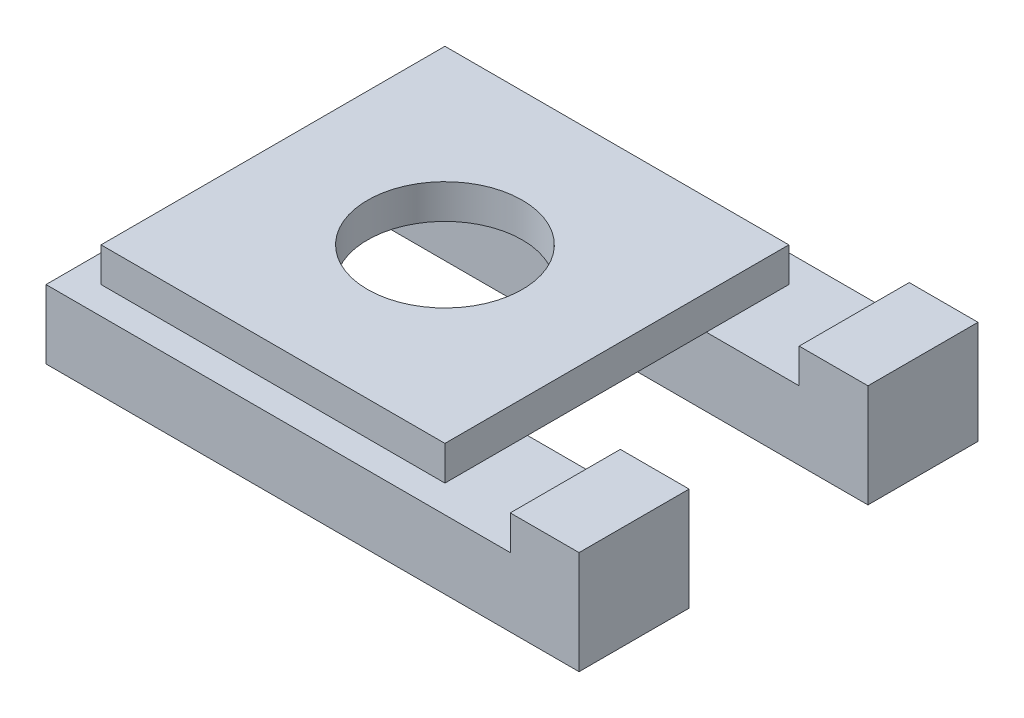
ISO-10303-21;
HEADER;
FILE_DESCRIPTION(('STEP AP214'),'2;1');
FILE_NAME('part.step','',(''),(''),'','','');
FILE_SCHEMA(('AUTOMOTIVE_DESIGN { 1 0 10303 214 1 1 1 1 }'));
ENDSEC;
DATA;
#1=APPLICATION_CONTEXT('core data for automotive mechanical design processes');
#2=APPLICATION_PROTOCOL_DEFINITION('international standard','automotive_design',2000,#1);
#3=PRODUCT_CONTEXT('',#1,'mechanical');
#4=PRODUCT('Part','Part','',(#3));
#5=PRODUCT_RELATED_PRODUCT_CATEGORY('part','',(#4));
#6=PRODUCT_DEFINITION_FORMATION('','',#4);
#7=PRODUCT_DEFINITION_CONTEXT('part definition',#1,'design');
#8=PRODUCT_DEFINITION('design','',#6,#7);
#9=PRODUCT_DEFINITION_SHAPE('','',#8);
#10=(LENGTH_UNIT() NAMED_UNIT(*) SI_UNIT(.MILLI.,.METRE.));
#11=(NAMED_UNIT(*) PLANE_ANGLE_UNIT() SI_UNIT($,.RADIAN.));
#12=(NAMED_UNIT(*) SI_UNIT($,.STERADIAN.) SOLID_ANGLE_UNIT());
#13=UNCERTAINTY_MEASURE_WITH_UNIT(LENGTH_MEASURE(1.E-05),#10,'distance_accuracy_value','');
#14=(GEOMETRIC_REPRESENTATION_CONTEXT(3) GLOBAL_UNCERTAINTY_ASSIGNED_CONTEXT((#13)) GLOBAL_UNIT_ASSIGNED_CONTEXT((#10,
#11,#12)) REPRESENTATION_CONTEXT('',''));
#15=CARTESIAN_POINT('',(0.,0.,0.));
#16=DIRECTION('',(0.,0.,1.));
#17=DIRECTION('',(1.,0.,0.));
#18=AXIS2_PLACEMENT_3D('',#15,#16,#17);
#19=CARTESIAN_POINT('',(0.,20.,0.));
#20=DIRECTION('',(0.,-1.,0.));
#21=DIRECTION('',(0.,0.,-1.));
#22=AXIS2_PLACEMENT_3D('',#19,#20,#21);
#23=PLANE('',#22);
#24=CARTESIAN_POINT('',(0.,20.,0.));
#25=DIRECTION('',(0.,1.,0.));
#26=DIRECTION('',(0.,0.,1.));
#27=AXIS2_PLACEMENT_3D('',#24,#25,#26);
#28=CIRCLE('',#27,22.5);
#29=CARTESIAN_POINT('',(0.,20.,22.5));
#30=VERTEX_POINT('',#29);
#31=EDGE_CURVE('E272',#30,#30,#28,.T.);
#32=ORIENTED_EDGE('',*,*,#31,.T.);
#33=EDGE_LOOP('',(#32));
#34=FACE_BOUND('',#33,.T.);
#35=DIRECTION('',(0.,0.,1.));
#36=VECTOR('',#35,1.);
#37=CARTESIAN_POINT('',(-50.,20.,0.));
#38=LINE('',#37,#36);
#39=CARTESIAN_POINT('',(-50.,20.,-26.));
#40=VERTEX_POINT('',#39);
#41=CARTESIAN_POINT('',(-50.,20.,26.));
#42=VERTEX_POINT('',#41);
#43=EDGE_CURVE('E302',#40,#42,#38,.T.);
#44=ORIENTED_EDGE('',*,*,#43,.F.);
#45=DIRECTION('',(1.,0.,0.));
#46=VECTOR('',#45,1.);
#47=CARTESIAN_POINT('',(0.,20.,-26.));
#48=LINE('',#47,#46);
#49=CARTESIAN_POINT('',(50.,20.,-26.));
#50=VERTEX_POINT('',#49);
#51=EDGE_CURVE('E242',#40,#50,#48,.T.);
#52=ORIENTED_EDGE('',*,*,#51,.T.);
#53=DIRECTION('',(0.,0.,1.));
#54=VECTOR('',#53,1.);
#55=CARTESIAN_POINT('',(50.,20.,0.));
#56=LINE('',#55,#54);
#57=CARTESIAN_POINT('',(50.,20.,26.));
#58=VERTEX_POINT('',#57);
#59=EDGE_CURVE('E78',#50,#58,#56,.T.);
#60=ORIENTED_EDGE('',*,*,#59,.T.);
#61=DIRECTION('',(1.,0.,0.));
#62=VECTOR('',#61,1.);
#63=CARTESIAN_POINT('',(0.,20.,26.));
#64=LINE('',#63,#62);
#65=EDGE_CURVE('E358',#42,#58,#64,.T.);
#66=ORIENTED_EDGE('',*,*,#65,.F.);
#67=EDGE_LOOP('',(#44,#52,#60,#66));
#68=FACE_BOUND('',#67,.T.);
#69=ADVANCED_FACE('F62',(#34,#68),#23,.T.);
#70=CARTESIAN_POINT('',(0.,20.,0.));
#71=DIRECTION('',(0.,1.,0.));
#72=DIRECTION('',(0.,0.,1.));
#73=AXIS2_PLACEMENT_3D('',#70,#71,#72);
#74=PLANE('',#73);
#75=DIRECTION('',(-1.,0.,0.));
#76=VECTOR('',#75,1.);
#77=CARTESIAN_POINT('',(0.,20.,50.));
#78=LINE('',#77,#76);
#79=CARTESIAN_POINT('',(50.,20.,50.));
#80=VERTEX_POINT('',#79);
#81=CARTESIAN_POINT('',(-50.,20.,50.));
#82=VERTEX_POINT('',#81);
#83=EDGE_CURVE('E301',#80,#82,#78,.T.);
#84=ORIENTED_EDGE('',*,*,#83,.T.);
#85=EDGE_CURVE('E277',#42,#82,#38,.T.);
#86=ORIENTED_EDGE('',*,*,#85,.F.);
#87=CARTESIAN_POINT('',(-58.,20.,26.));
#88=VERTEX_POINT('',#87);
#89=EDGE_CURVE('E353',#88,#42,#64,.T.);
#90=ORIENTED_EDGE('',*,*,#89,.F.);
#91=DIRECTION('',(0.,0.,-1.));
#92=VECTOR('',#91,1.);
#93=CARTESIAN_POINT('',(-58.,20.,0.));
#94=LINE('',#93,#92);
#95=CARTESIAN_POINT('',(-58.,20.,58.));
#96=VERTEX_POINT('',#95);
#97=EDGE_CURVE('E357',#96,#88,#94,.T.);
#98=ORIENTED_EDGE('',*,*,#97,.F.);
#99=DIRECTION('',(1.,0.,0.));
#100=VECTOR('',#99,1.);
#101=CARTESIAN_POINT('',(0.,20.,58.));
#102=LINE('',#101,#100);
#103=CARTESIAN_POINT('',(77.,20.,58.));
#104=VERTEX_POINT('',#103);
#105=EDGE_CURVE('E362',#96,#104,#102,.T.);
#106=ORIENTED_EDGE('',*,*,#105,.T.);
#107=DIRECTION('',(0.,0.,-1.));
#108=VECTOR('',#107,1.);
#109=CARTESIAN_POINT('',(77.,20.,0.));
#110=LINE('',#109,#108);
#111=CARTESIAN_POINT('',(77.,20.,26.));
#112=VERTEX_POINT('',#111);
#113=EDGE_CURVE('E327',#104,#112,#110,.T.);
#114=ORIENTED_EDGE('',*,*,#113,.T.);
#115=EDGE_CURVE('E86',#58,#112,#64,.T.);
#116=ORIENTED_EDGE('',*,*,#115,.F.);
#117=EDGE_CURVE('E306',#58,#80,#56,.T.);
#118=ORIENTED_EDGE('',*,*,#117,.T.);
#119=EDGE_LOOP('',(#84,#86,#90,#98,#106,#114,#116,#118));
#120=FACE_BOUND('',#119,.T.);
#121=ADVANCED_FACE('F412',(#120),#74,.T.);
#122=CARTESIAN_POINT('',(0.,20.,26.));
#123=DIRECTION('',(0.,0.,-1.));
#124=DIRECTION('',(-1.,0.,0.));
#125=AXIS2_PLACEMENT_3D('',#122,#123,#124);
#126=PLANE('',#125);
#127=DIRECTION('',(1.,0.,0.));
#128=VECTOR('',#127,1.);
#129=CARTESIAN_POINT('',(0.,0.,26.));
#130=LINE('',#129,#128);
#131=CARTESIAN_POINT('',(-58.,0.,26.));
#132=VERTEX_POINT('',#131);
#133=CARTESIAN_POINT('',(97.,0.,26.));
#134=VERTEX_POINT('',#133);
#135=EDGE_CURVE('E352',#132,#134,#130,.T.);
#136=ORIENTED_EDGE('',*,*,#135,.F.);
#137=DIRECTION('',(0.,-1.,0.));
#138=VECTOR('',#137,1.);
#139=CARTESIAN_POINT('',(-58.,20.,26.));
#140=LINE('',#139,#138);
#141=EDGE_CURVE('E12',#88,#132,#140,.T.);
#142=ORIENTED_EDGE('',*,*,#141,.F.);
#143=ORIENTED_EDGE('',*,*,#89,.T.);
#144=ORIENTED_EDGE('',*,*,#65,.T.);
#145=ORIENTED_EDGE('',*,*,#115,.T.);
#146=DIRECTION('',(0.,-1.,0.));
#147=VECTOR('',#146,1.);
#148=CARTESIAN_POINT('',(77.,30.,26.));
#149=LINE('',#148,#147);
#150=CARTESIAN_POINT('',(77.,30.,26.));
#151=VERTEX_POINT('',#150);
#152=EDGE_CURVE('E349',#151,#112,#149,.T.);
#153=ORIENTED_EDGE('',*,*,#152,.F.);
#154=DIRECTION('',(-1.,0.,0.));
#155=VECTOR('',#154,1.);
#156=CARTESIAN_POINT('',(0.,30.,26.));
#157=LINE('',#156,#155);
#158=CARTESIAN_POINT('',(97.,30.,26.));
#159=VERTEX_POINT('',#158);
#160=EDGE_CURVE('E332',#159,#151,#157,.T.);
#161=ORIENTED_EDGE('',*,*,#160,.F.);
#162=DIRECTION('',(0.,-1.,0.));
#163=VECTOR('',#162,1.);
#164=CARTESIAN_POINT('',(97.,20.,26.));
#165=LINE('',#164,#163);
#166=EDGE_CURVE('E366',#159,#134,#165,.T.);
#167=ORIENTED_EDGE('',*,*,#166,.T.);
#168=EDGE_LOOP('',(#136,#142,#143,#144,#145,#153,#161,#167));
#169=FACE_BOUND('',#168,.T.);
#170=ADVANCED_FACE('F64',(#169),#126,.T.);
#171=CARTESIAN_POINT('',(-58.,20.,0.));
#172=DIRECTION('',(-1.,0.,0.));
#173=DIRECTION('',(0.,0.,1.));
#174=AXIS2_PLACEMENT_3D('',#171,#172,#173);
#175=PLANE('',#174);
#176=DIRECTION('',(0.,0.,-1.));
#177=VECTOR('',#176,1.);
#178=CARTESIAN_POINT('',(-58.,0.,0.));
#179=LINE('',#178,#177);
#180=CARTESIAN_POINT('',(-58.,0.,58.));
#181=VERTEX_POINT('',#180);
#182=EDGE_CURVE('E370',#181,#132,#179,.T.);
#183=ORIENTED_EDGE('',*,*,#182,.F.);
#184=DIRECTION('',(0.,-1.,0.));
#185=VECTOR('',#184,1.);
#186=CARTESIAN_POINT('',(-58.,20.,58.));
#187=LINE('',#186,#185);
#188=EDGE_CURVE('E71',#96,#181,#187,.T.);
#189=ORIENTED_EDGE('',*,*,#188,.F.);
#190=ORIENTED_EDGE('',*,*,#97,.T.);
#191=ORIENTED_EDGE('',*,*,#141,.T.);
#192=EDGE_LOOP('',(#183,#189,#190,#191));
#193=FACE_BOUND('',#192,.T.);
#194=ADVANCED_FACE('F397',(#193),#175,.T.);
#195=CARTESIAN_POINT('',(0.,20.,58.));
#196=DIRECTION('',(0.,0.,-1.));
#197=DIRECTION('',(-1.,0.,0.));
#198=AXIS2_PLACEMENT_3D('',#195,#196,#197);
#199=PLANE('',#198);
#200=DIRECTION('',(1.,0.,0.));
#201=VECTOR('',#200,1.);
#202=CARTESIAN_POINT('',(0.,0.,58.));
#203=LINE('',#202,#201);
#204=CARTESIAN_POINT('',(97.,0.,58.));
#205=VERTEX_POINT('',#204);
#206=EDGE_CURVE('E374',#181,#205,#203,.T.);
#207=ORIENTED_EDGE('',*,*,#206,.T.);
#208=DIRECTION('',(0.,-1.,0.));
#209=VECTOR('',#208,1.);
#210=CARTESIAN_POINT('',(97.,20.,58.));
#211=LINE('',#210,#209);
#212=CARTESIAN_POINT('',(97.,30.,58.));
#213=VERTEX_POINT('',#212);
#214=EDGE_CURVE('E384',#213,#205,#211,.T.);
#215=ORIENTED_EDGE('',*,*,#214,.F.);
#216=DIRECTION('',(-1.,0.,0.));
#217=VECTOR('',#216,1.);
#218=CARTESIAN_POINT('',(0.,30.,58.));
#219=LINE('',#218,#217);
#220=CARTESIAN_POINT('',(77.,30.,58.));
#221=VERTEX_POINT('',#220);
#222=EDGE_CURVE('E339',#213,#221,#219,.T.);
#223=ORIENTED_EDGE('',*,*,#222,.T.);
#224=DIRECTION('',(0.,-1.,0.));
#225=VECTOR('',#224,1.);
#226=CARTESIAN_POINT('',(77.,30.,58.));
#227=LINE('',#226,#225);
#228=EDGE_CURVE('E343',#221,#104,#227,.T.);
#229=ORIENTED_EDGE('',*,*,#228,.T.);
#230=ORIENTED_EDGE('',*,*,#105,.F.);
#231=ORIENTED_EDGE('',*,*,#188,.T.);
#232=EDGE_LOOP('',(#207,#215,#223,#229,#230,#231));
#233=FACE_BOUND('',#232,.T.);
#234=ADVANCED_FACE('F390',(#233),#199,.F.);
#235=CARTESIAN_POINT('',(97.,20.,0.));
#236=DIRECTION('',(1.,0.,0.));
#237=DIRECTION('',(0.,0.,-1.));
#238=AXIS2_PLACEMENT_3D('',#235,#236,#237);
#239=PLANE('',#238);
#240=DIRECTION('',(0.,0.,1.));
#241=VECTOR('',#240,1.);
#242=CARTESIAN_POINT('',(97.,0.,0.));
#243=LINE('',#242,#241);
#244=EDGE_CURVE('E378',#134,#205,#243,.T.);
#245=ORIENTED_EDGE('',*,*,#244,.F.);
#246=ORIENTED_EDGE('',*,*,#166,.F.);
#247=DIRECTION('',(0.,0.,-1.));
#248=VECTOR('',#247,1.);
#249=CARTESIAN_POINT('',(97.,30.,0.));
#250=LINE('',#249,#248);
#251=EDGE_CURVE('E328',#213,#159,#250,.T.);
#252=ORIENTED_EDGE('',*,*,#251,.F.);
#253=ORIENTED_EDGE('',*,*,#214,.T.);
#254=EDGE_LOOP('',(#245,#246,#252,#253));
#255=FACE_BOUND('',#254,.T.);
#256=ADVANCED_FACE('F402',(#255),#239,.T.);
#257=CARTESIAN_POINT('',(0.,0.,0.));
#258=DIRECTION('',(0.,1.,0.));
#259=DIRECTION('',(0.,0.,1.));
#260=AXIS2_PLACEMENT_3D('',#257,#258,#259);
#261=PLANE('',#260);
#262=ORIENTED_EDGE('',*,*,#135,.T.);
#263=ORIENTED_EDGE('',*,*,#244,.T.);
#264=ORIENTED_EDGE('',*,*,#206,.F.);
#265=ORIENTED_EDGE('',*,*,#182,.T.);
#266=EDGE_LOOP('',(#262,#263,#264,#265));
#267=FACE_BOUND('',#266,.T.);
#268=ADVANCED_FACE('F395',(#267),#261,.F.);
#269=CARTESIAN_POINT('',(77.,30.,0.));
#270=DIRECTION('',(-1.,0.,0.));
#271=DIRECTION('',(0.,0.,1.));
#272=AXIS2_PLACEMENT_3D('',#269,#270,#271);
#273=PLANE('',#272);
#274=ORIENTED_EDGE('',*,*,#113,.F.);
#275=ORIENTED_EDGE('',*,*,#228,.F.);
#276=DIRECTION('',(0.,0.,-1.));
#277=VECTOR('',#276,1.);
#278=CARTESIAN_POINT('',(77.,30.,0.));
#279=LINE('',#278,#277);
#280=EDGE_CURVE('E335',#221,#151,#279,.T.);
#281=ORIENTED_EDGE('',*,*,#280,.T.);
#282=ORIENTED_EDGE('',*,*,#152,.T.);
#283=EDGE_LOOP('',(#274,#275,#281,#282));
#284=FACE_BOUND('',#283,.T.);
#285=ADVANCED_FACE('F410',(#284),#273,.T.);
#286=CARTESIAN_POINT('',(0.,30.,0.));
#287=DIRECTION('',(0.,1.,0.));
#288=DIRECTION('',(0.,0.,1.));
#289=AXIS2_PLACEMENT_3D('',#286,#287,#288);
#290=PLANE('',#289);
#291=ORIENTED_EDGE('',*,*,#251,.T.);
#292=ORIENTED_EDGE('',*,*,#160,.T.);
#293=ORIENTED_EDGE('',*,*,#280,.F.);
#294=ORIENTED_EDGE('',*,*,#222,.F.);
#295=EDGE_LOOP('',(#291,#292,#293,#294));
#296=FACE_BOUND('',#295,.T.);
#297=ADVANCED_FACE('F408',(#296),#290,.T.);
#298=CARTESIAN_POINT('',(0.,30.,0.));
#299=DIRECTION('',(0.,-1.,0.));
#300=DIRECTION('',(0.,0.,-1.));
#301=AXIS2_PLACEMENT_3D('',#298,#299,#300);
#302=PLANE('',#301);
#303=DIRECTION('',(0.,0.,1.));
#304=VECTOR('',#303,1.);
#305=CARTESIAN_POINT('',(-50.,30.,0.));
#306=LINE('',#305,#304);
#307=CARTESIAN_POINT('',(-50.,30.,-50.));
#308=VERTEX_POINT('',#307);
#309=CARTESIAN_POINT('',(-50.,30.,50.));
#310=VERTEX_POINT('',#309);
#311=EDGE_CURVE('E281',#308,#310,#306,.T.);
#312=ORIENTED_EDGE('',*,*,#311,.T.);
#313=DIRECTION('',(-1.,0.,0.));
#314=VECTOR('',#313,1.);
#315=CARTESIAN_POINT('',(0.,30.,50.));
#316=LINE('',#315,#314);
#317=CARTESIAN_POINT('',(50.,30.,50.));
#318=VERTEX_POINT('',#317);
#319=EDGE_CURVE('E284',#318,#310,#316,.T.);
#320=ORIENTED_EDGE('',*,*,#319,.F.);
#321=DIRECTION('',(0.,0.,1.));
#322=VECTOR('',#321,1.);
#323=CARTESIAN_POINT('',(50.,30.,0.));
#324=LINE('',#323,#322);
#325=CARTESIAN_POINT('',(50.,30.,-50.));
#326=VERTEX_POINT('',#325);
#327=EDGE_CURVE('E289',#326,#318,#324,.T.);
#328=ORIENTED_EDGE('',*,*,#327,.F.);
#329=DIRECTION('',(-1.,0.,0.));
#330=VECTOR('',#329,1.);
#331=CARTESIAN_POINT('',(0.,30.,-50.));
#332=LINE('',#331,#330);
#333=EDGE_CURVE('E293',#326,#308,#332,.T.);
#334=ORIENTED_EDGE('',*,*,#333,.T.);
#335=EDGE_LOOP('',(#312,#320,#328,#334));
#336=FACE_BOUND('',#335,.T.);
#337=CARTESIAN_POINT('',(0.,30.,0.));
#338=DIRECTION('',(0.,1.,0.));
#339=DIRECTION('',(0.,0.,1.));
#340=AXIS2_PLACEMENT_3D('',#337,#338,#339);
#341=CIRCLE('',#340,22.5);
#342=CARTESIAN_POINT('',(0.,30.,22.5));
#343=VERTEX_POINT('',#342);
#344=EDGE_CURVE('E273',#343,#343,#341,.T.);
#345=ORIENTED_EDGE('',*,*,#344,.F.);
#346=EDGE_LOOP('',(#345));
#347=FACE_BOUND('',#346,.T.);
#348=ADVANCED_FACE('F456',(#336,#347),#302,.F.);
#349=CARTESIAN_POINT('',(-50.,30.,0.));
#350=DIRECTION('',(1.,0.,0.));
#351=DIRECTION('',(0.,0.,-1.));
#352=AXIS2_PLACEMENT_3D('',#349,#350,#351);
#353=PLANE('',#352);
#354=CARTESIAN_POINT('',(-50.,20.,-50.));
#355=VERTEX_POINT('',#354);
#356=EDGE_CURVE('E297',#355,#40,#38,.T.);
#357=ORIENTED_EDGE('',*,*,#356,.T.);
#358=ORIENTED_EDGE('',*,*,#43,.T.);
#359=ORIENTED_EDGE('',*,*,#85,.T.);
#360=DIRECTION('',(0.,-1.,0.));
#361=VECTOR('',#360,1.);
#362=CARTESIAN_POINT('',(-50.,30.,50.));
#363=LINE('',#362,#361);
#364=EDGE_CURVE('E323',#310,#82,#363,.T.);
#365=ORIENTED_EDGE('',*,*,#364,.F.);
#366=ORIENTED_EDGE('',*,*,#311,.F.);
#367=DIRECTION('',(0.,-1.,0.));
#368=VECTOR('',#367,1.);
#369=CARTESIAN_POINT('',(-50.,30.,-50.));
#370=LINE('',#369,#368);
#371=EDGE_CURVE('E296',#308,#355,#370,.T.);
#372=ORIENTED_EDGE('',*,*,#371,.T.);
#373=EDGE_LOOP('',(#357,#358,#359,#365,#366,#372));
#374=FACE_BOUND('',#373,.T.);
#375=ADVANCED_FACE('F441',(#374),#353,.F.);
#376=CARTESIAN_POINT('',(0.,30.,50.));
#377=DIRECTION('',(0.,0.,1.));
#378=DIRECTION('',(1.,0.,0.));
#379=AXIS2_PLACEMENT_3D('',#376,#377,#378);
#380=PLANE('',#379);
#381=ORIENTED_EDGE('',*,*,#83,.F.);
#382=DIRECTION('',(0.,-1.,0.));
#383=VECTOR('',#382,1.);
#384=CARTESIAN_POINT('',(50.,30.,50.));
#385=LINE('',#384,#383);
#386=EDGE_CURVE('E320',#318,#80,#385,.T.);
#387=ORIENTED_EDGE('',*,*,#386,.F.);
#388=ORIENTED_EDGE('',*,*,#319,.T.);
#389=ORIENTED_EDGE('',*,*,#364,.T.);
#390=EDGE_LOOP('',(#381,#387,#388,#389));
#391=FACE_BOUND('',#390,.T.);
#392=ADVANCED_FACE('F453',(#391),#380,.T.);
#393=CARTESIAN_POINT('',(50.,30.,0.));
#394=DIRECTION('',(1.,0.,0.));
#395=DIRECTION('',(0.,0.,-1.));
#396=AXIS2_PLACEMENT_3D('',#393,#394,#395);
#397=PLANE('',#396);
#398=CARTESIAN_POINT('',(50.,20.,-50.));
#399=VERTEX_POINT('',#398);
#400=EDGE_CURVE('E307',#399,#50,#56,.T.);
#401=ORIENTED_EDGE('',*,*,#400,.F.);
#402=DIRECTION('',(0.,-1.,0.));
#403=VECTOR('',#402,1.);
#404=CARTESIAN_POINT('',(50.,30.,-50.));
#405=LINE('',#404,#403);
#406=EDGE_CURVE('E316',#326,#399,#405,.T.);
#407=ORIENTED_EDGE('',*,*,#406,.F.);
#408=ORIENTED_EDGE('',*,*,#327,.T.);
#409=ORIENTED_EDGE('',*,*,#386,.T.);
#410=ORIENTED_EDGE('',*,*,#117,.F.);
#411=ORIENTED_EDGE('',*,*,#59,.F.);
#412=EDGE_LOOP('',(#401,#407,#408,#409,#410,#411));
#413=FACE_BOUND('',#412,.T.);
#414=ADVANCED_FACE('F450',(#413),#397,.T.);
#415=CARTESIAN_POINT('',(0.,30.,-50.));
#416=DIRECTION('',(0.,0.,1.));
#417=DIRECTION('',(1.,0.,0.));
#418=AXIS2_PLACEMENT_3D('',#415,#416,#417);
#419=PLANE('',#418);
#420=DIRECTION('',(-1.,0.,0.));
#421=VECTOR('',#420,1.);
#422=CARTESIAN_POINT('',(0.,20.,-50.));
#423=LINE('',#422,#421);
#424=EDGE_CURVE('E285',#399,#355,#423,.T.);
#425=ORIENTED_EDGE('',*,*,#424,.T.);
#426=ORIENTED_EDGE('',*,*,#371,.F.);
#427=ORIENTED_EDGE('',*,*,#333,.F.);
#428=ORIENTED_EDGE('',*,*,#406,.T.);
#429=EDGE_LOOP('',(#425,#426,#427,#428));
#430=FACE_BOUND('',#429,.T.);
#431=ADVANCED_FACE('F447',(#430),#419,.F.);
#432=CARTESIAN_POINT('',(0.,30.,0.));
#433=DIRECTION('',(0.,-1.,0.));
#434=DIRECTION('',(0.,0.,-1.));
#435=AXIS2_PLACEMENT_3D('',#432,#433,#434);
#436=CYLINDRICAL_SURFACE('',#435,22.5);
#437=ORIENTED_EDGE('',*,*,#344,.T.);
#438=EDGE_LOOP('',(#437));
#439=FACE_BOUND('',#438,.T.);
#440=ORIENTED_EDGE('',*,*,#31,.F.);
#441=EDGE_LOOP('',(#440));
#442=FACE_BOUND('',#441,.T.);
#443=ADVANCED_FACE('F462',(#439,#442),#436,.F.);
#444=CARTESIAN_POINT('',(0.,20.,0.));
#445=DIRECTION('',(0.,1.,0.));
#446=DIRECTION('',(0.,0.,1.));
#447=AXIS2_PLACEMENT_3D('',#444,#445,#446);
#448=PLANE('',#447);
#449=ORIENTED_EDGE('',*,*,#356,.F.);
#450=ORIENTED_EDGE('',*,*,#424,.F.);
#451=ORIENTED_EDGE('',*,*,#400,.T.);
#452=CARTESIAN_POINT('',(77.,20.,-26.));
#453=VERTEX_POINT('',#452);
#454=EDGE_CURVE('E236',#50,#453,#48,.T.);
#455=ORIENTED_EDGE('',*,*,#454,.T.);
#456=DIRECTION('',(0.,0.,-1.));
#457=VECTOR('',#456,1.);
#458=CARTESIAN_POINT('',(77.,20.,0.));
#459=LINE('',#458,#457);
#460=CARTESIAN_POINT('',(77.,20.,-58.));
#461=VERTEX_POINT('',#460);
#462=EDGE_CURVE('E203',#453,#461,#459,.T.);
#463=ORIENTED_EDGE('',*,*,#462,.T.);
#464=DIRECTION('',(1.,0.,0.));
#465=VECTOR('',#464,1.);
#466=CARTESIAN_POINT('',(0.,20.,-58.));
#467=LINE('',#466,#465);
#468=CARTESIAN_POINT('',(-58.,20.,-58.));
#469=VERTEX_POINT('',#468);
#470=EDGE_CURVE('E210',#469,#461,#467,.T.);
#471=ORIENTED_EDGE('',*,*,#470,.F.);
#472=DIRECTION('',(0.,0.,1.));
#473=VECTOR('',#472,1.);
#474=CARTESIAN_POINT('',(-58.,20.,0.));
#475=LINE('',#474,#473);
#476=CARTESIAN_POINT('',(-58.,20.,-26.));
#477=VERTEX_POINT('',#476);
#478=EDGE_CURVE('E232',#469,#477,#475,.T.);
#479=ORIENTED_EDGE('',*,*,#478,.T.);
#480=EDGE_CURVE('E238',#477,#40,#48,.T.);
#481=ORIENTED_EDGE('',*,*,#480,.T.);
#482=EDGE_LOOP('',(#449,#450,#451,#455,#463,#471,#479,#481));
#483=FACE_BOUND('',#482,.T.);
#484=ADVANCED_FACE('F426',(#483),#448,.T.);
#485=CARTESIAN_POINT('',(-58.,20.,0.));
#486=DIRECTION('',(1.,0.,0.));
#487=DIRECTION('',(0.,0.,-1.));
#488=AXIS2_PLACEMENT_3D('',#485,#486,#487);
#489=PLANE('',#488);
#490=DIRECTION('',(0.,0.,1.));
#491=VECTOR('',#490,1.);
#492=CARTESIAN_POINT('',(-58.,0.,0.));
#493=LINE('',#492,#491);
#494=CARTESIAN_POINT('',(-58.,0.,-58.));
#495=VERTEX_POINT('',#494);
#496=CARTESIAN_POINT('',(-58.,0.,-26.));
#497=VERTEX_POINT('',#496);
#498=EDGE_CURVE('E215',#495,#497,#493,.T.);
#499=ORIENTED_EDGE('',*,*,#498,.T.);
#500=DIRECTION('',(0.,-1.,0.));
#501=VECTOR('',#500,1.);
#502=CARTESIAN_POINT('',(-58.,20.,-26.));
#503=LINE('',#502,#501);
#504=EDGE_CURVE('E268',#477,#497,#503,.T.);
#505=ORIENTED_EDGE('',*,*,#504,.F.);
#506=ORIENTED_EDGE('',*,*,#478,.F.);
#507=DIRECTION('',(0.,-1.,0.));
#508=VECTOR('',#507,1.);
#509=CARTESIAN_POINT('',(-58.,20.,-58.));
#510=LINE('',#509,#508);
#511=EDGE_CURVE('E245',#469,#495,#510,.T.);
#512=ORIENTED_EDGE('',*,*,#511,.T.);
#513=EDGE_LOOP('',(#499,#505,#506,#512));
#514=FACE_BOUND('',#513,.T.);
#515=ADVANCED_FACE('F439',(#514),#489,.F.);
#516=CARTESIAN_POINT('',(0.,20.,-26.));
#517=DIRECTION('',(0.,0.,-1.));
#518=DIRECTION('',(-1.,0.,0.));
#519=AXIS2_PLACEMENT_3D('',#516,#517,#518);
#520=PLANE('',#519);
#521=DIRECTION('',(1.,0.,0.));
#522=VECTOR('',#521,1.);
#523=CARTESIAN_POINT('',(0.,0.,-26.));
#524=LINE('',#523,#522);
#525=CARTESIAN_POINT('',(97.,0.,-26.));
#526=VERTEX_POINT('',#525);
#527=EDGE_CURVE('E249',#497,#526,#524,.T.);
#528=ORIENTED_EDGE('',*,*,#527,.T.);
#529=DIRECTION('',(0.,-1.,0.));
#530=VECTOR('',#529,1.);
#531=CARTESIAN_POINT('',(97.,20.,-26.));
#532=LINE('',#531,#530);
#533=CARTESIAN_POINT('',(97.,30.,-26.));
#534=VERTEX_POINT('',#533);
#535=EDGE_CURVE('E264',#534,#526,#532,.T.);
#536=ORIENTED_EDGE('',*,*,#535,.F.);
#537=DIRECTION('',(-1.,0.,0.));
#538=VECTOR('',#537,1.);
#539=CARTESIAN_POINT('',(0.,30.,-26.));
#540=LINE('',#539,#538);
#541=CARTESIAN_POINT('',(77.,30.,-26.));
#542=VERTEX_POINT('',#541);
#543=EDGE_CURVE('E221',#534,#542,#540,.T.);
#544=ORIENTED_EDGE('',*,*,#543,.T.);
#545=DIRECTION('',(0.,-1.,0.));
#546=VECTOR('',#545,1.);
#547=CARTESIAN_POINT('',(77.,30.,-26.));
#548=LINE('',#547,#546);
#549=EDGE_CURVE('E216',#542,#453,#548,.T.);
#550=ORIENTED_EDGE('',*,*,#549,.T.);
#551=ORIENTED_EDGE('',*,*,#454,.F.);
#552=ORIENTED_EDGE('',*,*,#51,.F.);
#553=ORIENTED_EDGE('',*,*,#480,.F.);
#554=ORIENTED_EDGE('',*,*,#504,.T.);
#555=EDGE_LOOP('',(#528,#536,#544,#550,#551,#552,#553,#554));
#556=FACE_BOUND('',#555,.T.);
#557=ADVANCED_FACE('F429',(#556),#520,.F.);
#558=CARTESIAN_POINT('',(97.,20.,0.));
#559=DIRECTION('',(-1.,0.,0.));
#560=DIRECTION('',(0.,0.,1.));
#561=AXIS2_PLACEMENT_3D('',#558,#559,#560);
#562=PLANE('',#561);
#563=DIRECTION('',(0.,0.,-1.));
#564=VECTOR('',#563,1.);
#565=CARTESIAN_POINT('',(97.,0.,0.));
#566=LINE('',#565,#564);
#567=CARTESIAN_POINT('',(97.,0.,-58.));
#568=VERTEX_POINT('',#567);
#569=EDGE_CURVE('E252',#526,#568,#566,.T.);
#570=ORIENTED_EDGE('',*,*,#569,.T.);
#571=DIRECTION('',(0.,-1.,0.));
#572=VECTOR('',#571,1.);
#573=CARTESIAN_POINT('',(97.,20.,-58.));
#574=LINE('',#573,#572);
#575=CARTESIAN_POINT('',(97.,30.,-58.));
#576=VERTEX_POINT('',#575);
#577=EDGE_CURVE('E261',#576,#568,#574,.T.);
#578=ORIENTED_EDGE('',*,*,#577,.F.);
#579=DIRECTION('',(0.,0.,1.));
#580=VECTOR('',#579,1.);
#581=CARTESIAN_POINT('',(97.,30.,0.));
#582=LINE('',#581,#580);
#583=EDGE_CURVE('E200',#576,#534,#582,.T.);
#584=ORIENTED_EDGE('',*,*,#583,.T.);
#585=ORIENTED_EDGE('',*,*,#535,.T.);
#586=EDGE_LOOP('',(#570,#578,#584,#585));
#587=FACE_BOUND('',#586,.T.);
#588=ADVANCED_FACE('F431',(#587),#562,.F.);
#589=CARTESIAN_POINT('',(0.,20.,-58.));
#590=DIRECTION('',(0.,0.,-1.));
#591=DIRECTION('',(-1.,0.,0.));
#592=AXIS2_PLACEMENT_3D('',#589,#590,#591);
#593=PLANE('',#592);
#594=DIRECTION('',(1.,0.,0.));
#595=VECTOR('',#594,1.);
#596=CARTESIAN_POINT('',(0.,0.,-58.));
#597=LINE('',#596,#595);
#598=EDGE_CURVE('E237',#495,#568,#597,.T.);
#599=ORIENTED_EDGE('',*,*,#598,.F.);
#600=ORIENTED_EDGE('',*,*,#511,.F.);
#601=ORIENTED_EDGE('',*,*,#470,.T.);
#602=DIRECTION('',(0.,-1.,0.));
#603=VECTOR('',#602,1.);
#604=CARTESIAN_POINT('',(77.,30.,-58.));
#605=LINE('',#604,#603);
#606=CARTESIAN_POINT('',(77.,30.,-58.));
#607=VERTEX_POINT('',#606);
#608=EDGE_CURVE('E206',#607,#461,#605,.T.);
#609=ORIENTED_EDGE('',*,*,#608,.F.);
#610=DIRECTION('',(-1.,0.,0.));
#611=VECTOR('',#610,1.);
#612=CARTESIAN_POINT('',(0.,30.,-58.));
#613=LINE('',#612,#611);
#614=EDGE_CURVE('E192',#576,#607,#613,.T.);
#615=ORIENTED_EDGE('',*,*,#614,.F.);
#616=ORIENTED_EDGE('',*,*,#577,.T.);
#617=EDGE_LOOP('',(#599,#600,#601,#609,#615,#616));
#618=FACE_BOUND('',#617,.T.);
#619=ADVANCED_FACE('F208',(#618),#593,.T.);
#620=CARTESIAN_POINT('',(0.,0.,0.));
#621=DIRECTION('',(0.,1.,0.));
#622=DIRECTION('',(0.,0.,1.));
#623=AXIS2_PLACEMENT_3D('',#620,#621,#622);
#624=PLANE('',#623);
#625=ORIENTED_EDGE('',*,*,#498,.F.);
#626=ORIENTED_EDGE('',*,*,#598,.T.);
#627=ORIENTED_EDGE('',*,*,#569,.F.);
#628=ORIENTED_EDGE('',*,*,#527,.F.);
#629=EDGE_LOOP('',(#625,#626,#627,#628));
#630=FACE_BOUND('',#629,.T.);
#631=ADVANCED_FACE('F436',(#630),#624,.F.);
#632=CARTESIAN_POINT('',(77.,30.,0.));
#633=DIRECTION('',(-1.,0.,0.));
#634=DIRECTION('',(0.,0.,1.));
#635=AXIS2_PLACEMENT_3D('',#632,#633,#634);
#636=PLANE('',#635);
#637=ORIENTED_EDGE('',*,*,#462,.F.);
#638=ORIENTED_EDGE('',*,*,#549,.F.);
#639=DIRECTION('',(0.,0.,-1.));
#640=VECTOR('',#639,1.);
#641=CARTESIAN_POINT('',(77.,30.,0.));
#642=LINE('',#641,#640);
#643=EDGE_CURVE('E197',#542,#607,#642,.T.);
#644=ORIENTED_EDGE('',*,*,#643,.T.);
#645=ORIENTED_EDGE('',*,*,#608,.T.);
#646=EDGE_LOOP('',(#637,#638,#644,#645));
#647=FACE_BOUND('',#646,.T.);
#648=ADVANCED_FACE('F218',(#647),#636,.T.);
#649=CARTESIAN_POINT('',(0.,30.,0.));
#650=DIRECTION('',(0.,-1.,0.));
#651=DIRECTION('',(0.,0.,-1.));
#652=AXIS2_PLACEMENT_3D('',#649,#650,#651);
#653=PLANE('',#652);
#654=ORIENTED_EDGE('',*,*,#614,.T.);
#655=ORIENTED_EDGE('',*,*,#643,.F.);
#656=ORIENTED_EDGE('',*,*,#543,.F.);
#657=ORIENTED_EDGE('',*,*,#583,.F.);
#658=EDGE_LOOP('',(#654,#655,#656,#657));
#659=FACE_BOUND('',#658,.T.);
#660=ADVANCED_FACE('F194',(#659),#653,.F.);
#661=CLOSED_SHELL('',(#69,#121,#170,#194,#234,#256,#268,#285,#297,#348,#375,#392,#414,#431,#443,
#484,#515,#557,#588,#619,#631,#648,#660));
#662=MANIFOLD_SOLID_BREP('B2',#661);
#663=ADVANCED_BREP_SHAPE_REPRESENTATION('',(#18,#662),#14);
#664=SHAPE_DEFINITION_REPRESENTATION(#9,#663);
ENDSEC;
END-ISO-10303-21;
